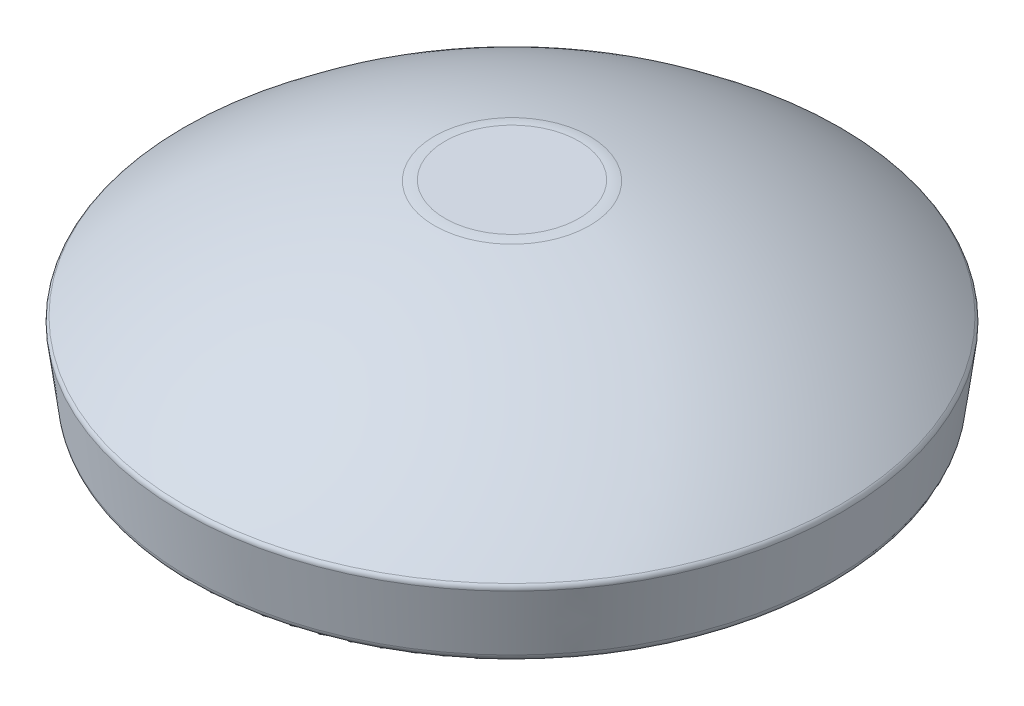
ISO-10303-21;
HEADER;
FILE_DESCRIPTION(('STEP AP214'),'2;1');
FILE_NAME('part.step','',(''),(''),'','','');
FILE_SCHEMA(('AUTOMOTIVE_DESIGN { 1 0 10303 214 1 1 1 1 }'));
ENDSEC;
DATA;
#1=APPLICATION_CONTEXT('core data for automotive mechanical design processes');
#2=APPLICATION_PROTOCOL_DEFINITION('international standard','automotive_design',2000,#1);
#3=PRODUCT_CONTEXT('',#1,'mechanical');
#4=PRODUCT('Part','Part','',(#3));
#5=PRODUCT_RELATED_PRODUCT_CATEGORY('part','',(#4));
#6=PRODUCT_DEFINITION_FORMATION('','',#4);
#7=PRODUCT_DEFINITION_CONTEXT('part definition',#1,'design');
#8=PRODUCT_DEFINITION('design','',#6,#7);
#9=PRODUCT_DEFINITION_SHAPE('','',#8);
#10=(LENGTH_UNIT() NAMED_UNIT(*) SI_UNIT(.MILLI.,.METRE.));
#11=(NAMED_UNIT(*) PLANE_ANGLE_UNIT() SI_UNIT($,.RADIAN.));
#12=(NAMED_UNIT(*) SI_UNIT($,.STERADIAN.) SOLID_ANGLE_UNIT());
#13=UNCERTAINTY_MEASURE_WITH_UNIT(LENGTH_MEASURE(1.E-05),#10,'distance_accuracy_value','');
#14=(GEOMETRIC_REPRESENTATION_CONTEXT(3) GLOBAL_UNCERTAINTY_ASSIGNED_CONTEXT((#13)) GLOBAL_UNIT_ASSIGNED_CONTEXT((#10,
#11,#12)) REPRESENTATION_CONTEXT('',''));
#15=CARTESIAN_POINT('',(0.,0.,0.));
#16=DIRECTION('',(0.,0.,1.));
#17=DIRECTION('',(1.,0.,0.));
#18=AXIS2_PLACEMENT_3D('',#15,#16,#17);
#19=CARTESIAN_POINT('',(0.,0.,0.));
#20=DIRECTION('',(0.,-1.,0.));
#21=DIRECTION('',(1.,0.,0.));
#22=AXIS2_PLACEMENT_3D('',#19,#20,#21);
#23=PLANE('',#22);
#24=CARTESIAN_POINT('',(0.,0.,0.));
#25=DIRECTION('',(0.,-1.,0.));
#26=DIRECTION('',(1.,0.,0.));
#27=AXIS2_PLACEMENT_3D('',#24,#25,#26);
#28=CIRCLE('',#27,13.7405967654397);
#29=CARTESIAN_POINT('',(13.7405967654397,0.,0.));
#30=VERTEX_POINT('',#29);
#31=EDGE_CURVE('E50',#30,#30,#28,.T.);
#32=ORIENTED_EDGE('',*,*,#31,.T.);
#33=EDGE_LOOP('',(#32));
#34=FACE_BOUND('',#33,.T.);
#35=DIRECTION('',(-1.,0.,0.));
#36=VECTOR('',#35,1.);
#37=CARTESIAN_POINT('',(-3.07418053105214,0.,-0.79375));
#38=LINE('',#37,#36);
#39=CARTESIAN_POINT('',(5.65961005171735,0.,-0.79375));
#40=VERTEX_POINT('',#39);
#41=CARTESIAN_POINT('',(-5.65961005171735,0.,-0.79375));
#42=VERTEX_POINT('',#41);
#43=EDGE_CURVE('E52',#40,#42,#38,.T.);
#44=ORIENTED_EDGE('',*,*,#43,.F.);
#45=CARTESIAN_POINT('',(0.,0.,0.));
#46=DIRECTION('',(0.,-1.,0.));
#47=DIRECTION('',(1.,0.,0.));
#48=AXIS2_PLACEMENT_3D('',#45,#46,#47);
#49=CIRCLE('',#48,5.715);
#50=EDGE_CURVE('E84',#40,#42,#49,.F.);
#51=ORIENTED_EDGE('',*,*,#50,.T.);
#52=EDGE_LOOP('',(#44,#51));
#53=FACE_BOUND('',#52,.T.);
#54=DIRECTION('',(1.,0.,0.));
#55=VECTOR('',#54,1.);
#56=CARTESIAN_POINT('',(-3.07418053105214,0.,0.79375));
#57=LINE('',#56,#55);
#58=CARTESIAN_POINT('',(-5.65961005171735,0.,0.79375));
#59=VERTEX_POINT('',#58);
#60=CARTESIAN_POINT('',(5.65961005171734,0.,0.79375));
#61=VERTEX_POINT('',#60);
#62=EDGE_CURVE('E94',#59,#61,#57,.T.);
#63=ORIENTED_EDGE('',*,*,#62,.F.);
#64=CARTESIAN_POINT('',(0.,0.,0.));
#65=DIRECTION('',(0.,-1.,0.));
#66=DIRECTION('',(1.,0.,0.));
#67=AXIS2_PLACEMENT_3D('',#64,#65,#66);
#68=CIRCLE('',#67,5.715);
#69=EDGE_CURVE('E107',#59,#61,#68,.F.);
#70=ORIENTED_EDGE('',*,*,#69,.T.);
#71=EDGE_LOOP('',(#63,#70));
#72=FACE_BOUND('',#71,.T.);
#73=ADVANCED_FACE('F39',(#34,#53,#72),#23,.T.);
#74=CARTESIAN_POINT('',(0.,0.,0.));
#75=DIRECTION('',(0.,1.,0.));
#76=DIRECTION('',(-1.,0.,0.));
#77=AXIS2_PLACEMENT_3D('',#74,#75,#76);
#78=CONICAL_SURFACE('',#77,14.097,0.130899693899568);
#79=CARTESIAN_POINT('',(0.,0.353354155481767,0.));
#80=DIRECTION('',(0.,-1.,0.));
#81=DIRECTION('',(1.,0.,0.));
#82=AXIS2_PLACEMENT_3D('',#79,#80,#81);
#83=CIRCLE('',#82,14.1435199571021);
#84=CARTESIAN_POINT('',(14.1435199571021,0.353354155481767,0.));
#85=VERTEX_POINT('',#84);
#86=EDGE_CURVE('E11',#85,#85,#83,.F.);
#87=ORIENTED_EDGE('',*,*,#86,.T.);
#88=EDGE_LOOP('',(#87));
#89=FACE_BOUND('',#88,.T.);
#90=CARTESIAN_POINT('',(0.,3.03636754474858,0.));
#91=DIRECTION('',(0.,-1.,0.));
#92=DIRECTION('',(1.,0.,0.));
#93=AXIS2_PLACEMENT_3D('',#90,#91,#92);
#94=CIRCLE('',#93,14.4967453708594);
#95=CARTESIAN_POINT('',(14.4967453708594,3.03636754474858,0.));
#96=VERTEX_POINT('',#95);
#97=EDGE_CURVE('E152',#96,#96,#94,.T.);
#98=ORIENTED_EDGE('',*,*,#97,.T.);
#99=EDGE_LOOP('',(#98));
#100=FACE_BOUND('',#99,.T.);
#101=ADVANCED_FACE('F171',(#89,#100),#78,.T.);
#102=CARTESIAN_POINT('',(0.,-15.3417582357825,0.));
#103=DIRECTION('',(0.,-1.,0.));
#104=DIRECTION('',(1.,0.,0.));
#105=AXIS2_PLACEMENT_3D('',#102,#103,#104);
#106=DEGENERATE_TOROIDAL_SURFACE('',#105,1.02240832640357,24.1719111757937,.F.);
#107=CARTESIAN_POINT('',(0.,3.2650426601994,0.));
#108=DIRECTION('',(0.,-1.,0.));
#109=DIRECTION('',(1.,0.,0.));
#110=AXIS2_PLACEMENT_3D('',#107,#108,#109);
#111=CIRCLE('',#110,14.4070521407595);
#112=CARTESIAN_POINT('',(14.4070521407595,3.2650426601994,0.));
#113=VERTEX_POINT('',#112);
#114=EDGE_CURVE('E186',#113,#113,#111,.F.);
#115=ORIENTED_EDGE('',*,*,#114,.T.);
#116=EDGE_LOOP('',(#115));
#117=FACE_BOUND('',#116,.T.);
#118=CARTESIAN_POINT('',(0.,8.4198079827753,0.));
#119=DIRECTION('',(0.,-1.,0.));
#120=DIRECTION('',(1.,0.,0.));
#121=AXIS2_PLACEMENT_3D('',#118,#119,#120);
#122=CIRCLE('',#121,3.41259570195462);
#123=CARTESIAN_POINT('',(3.41259570195462,8.4198079827753,0.));
#124=VERTEX_POINT('',#123);
#125=EDGE_CURVE('E90',#124,#124,#122,.T.);
#126=ORIENTED_EDGE('',*,*,#125,.T.);
#127=EDGE_LOOP('',(#126));
#128=FACE_BOUND('',#127,.T.);
#129=ADVANCED_FACE('F170',(#117,#128),#106,.F.);
#130=CARTESIAN_POINT('',(0.,8.46292729526157,0.));
#131=DIRECTION('',(0.,1.,0.));
#132=DIRECTION('',(-1.,0.,0.));
#133=AXIS2_PLACEMENT_3D('',#130,#131,#132);
#134=PLANE('',#133);
#135=CARTESIAN_POINT('',(0.,8.46292729526157,0.));
#136=DIRECTION('',(0.,1.,0.));
#137=DIRECTION('',(-1.,0.,0.));
#138=AXIS2_PLACEMENT_3D('',#135,#136,#137);
#139=CIRCLE('',#138,2.9465626212394);
#140=CARTESIAN_POINT('',(-2.9465626212394,8.46292729526157,0.));
#141=VERTEX_POINT('',#140);
#142=EDGE_CURVE('E106',#141,#141,#139,.T.);
#143=ORIENTED_EDGE('',*,*,#142,.T.);
#144=EDGE_LOOP('',(#143));
#145=FACE_BOUND('',#144,.T.);
#146=ADVANCED_FACE('F159',(#145),#134,.T.);
#147=CARTESIAN_POINT('',(-3.07418053105214,-2.54,0.79375));
#148=DIRECTION('',(0.,0.,1.));
#149=DIRECTION('',(1.,0.,0.));
#150=AXIS2_PLACEMENT_3D('',#147,#148,#149);
#151=PLANE('',#150);
#152=ORIENTED_EDGE('',*,*,#62,.T.);
#153=CARTESIAN_POINT('',(5.65961005171735,0.,0.79375));
#154=CARTESIAN_POINT('',(5.58636669045371,6.87876863831746E-06,0.79375));
#155=CARTESIAN_POINT('',(5.51312786882935,-0.00310690690221392,0.79375));
#156=CARTESIAN_POINT('',(5.36718058849575,-0.0155079510268095,0.79375));
#157=CARTESIAN_POINT('',(5.29447208602195,-0.0247946940943371,0.79375));
#158=CARTESIAN_POINT('',(5.15015725747529,-0.0494630612825748,0.79375));
#159=CARTESIAN_POINT('',(5.07855002583489,-0.0648393651336421,0.79375));
#160=CARTESIAN_POINT('',(4.93690093432029,-0.101552155733692,0.79375));
#161=CARTESIAN_POINT('',(4.8668590723264,-0.122888634411408,0.79375));
#162=CARTESIAN_POINT('',(4.65977700789013,-0.195644306264122,0.79375));
#163=CARTESIAN_POINT('',(4.52569660019021,-0.255824146479722,0.79375));
#164=CARTESIAN_POINT('',(4.26958149414839,-0.397740213595126,0.79375));
#165=CARTESIAN_POINT('',(4.14754593142529,-0.479474892094562,0.79375));
#166=CARTESIAN_POINT('',(3.91860310825917,-0.662509379665438,0.79375));
#167=CARTESIAN_POINT('',(3.81173527719307,-0.763858619662495,0.79375));
#168=CARTESIAN_POINT('',(3.61670606970322,-0.983245161335671,0.79375));
#169=CARTESIAN_POINT('',(3.52854827975405,-1.10128565529816,0.79375));
#170=CARTESIAN_POINT('',(3.37456729018714,-1.34952921628819,0.79375));
#171=CARTESIAN_POINT('',(3.30853384628879,-1.47960187151978,0.79375));
#172=CARTESIAN_POINT('',(3.19998378841046,-1.74915098864019,0.79375));
#173=CARTESIAN_POINT('',(3.15744252137307,-1.88861741938909,0.79375));
#174=CARTESIAN_POINT('',(3.10975549797157,-2.11435822783824,0.79375));
#175=CARTESIAN_POINT('',(3.09642822146772,-2.19898364373044,0.79375));
#176=CARTESIAN_POINT('',(3.07864064507304,-2.36905799309541,0.79375));
#177=CARTESIAN_POINT('',(3.07416973935671,-2.45450581827047,0.79375));
#178=CARTESIAN_POINT('',(3.07418053105216,-2.54000000000001,0.79375));
#179=B_SPLINE_CURVE_WITH_KNOTS('',3,(#153,#154,#155,#156,#157,#158,#159,#160,#161,#162,#163,
#164,#165,#166,#167,#168,#169,#170,#171,#172,#173,#174,#175,#176,#177,#178),.UNSPECIFIED.,.F.,
.F.,(4,2,2,2,2,2,2,2,2,2,2,2,4),(0.,0.219656159228749,0.4392939814543,0.658740334421184,
0.878186390215383,1.31682682722262,1.75543576289896,2.19516478509212,2.63497802171237,
3.07048467479963,3.50553342764897,3.76211696206469,4.01839304217818),.UNSPECIFIED.);
#180=CARTESIAN_POINT('',(3.07418053105214,-2.54,0.79375));
#181=VERTEX_POINT('',#180);
#182=EDGE_CURVE('E147',#61,#181,#179,.T.);
#183=ORIENTED_EDGE('',*,*,#182,.T.);
#184=DIRECTION('',(1.,0.,0.));
#185=VECTOR('',#184,1.);
#186=CARTESIAN_POINT('',(-3.07418053105214,-2.54,0.79375));
#187=LINE('',#186,#185);
#188=CARTESIAN_POINT('',(-3.07418053105214,-2.54,0.79375));
#189=VERTEX_POINT('',#188);
#190=EDGE_CURVE('E100',#189,#181,#187,.T.);
#191=ORIENTED_EDGE('',*,*,#190,.F.);
#192=CARTESIAN_POINT('',(-3.07418053105214,-2.54,0.79375));
#193=CARTESIAN_POINT('',(-3.07417105852471,-2.46986619805415,0.79375));
#194=CARTESIAN_POINT('',(-3.0771804273833,-2.39973703787502,0.79375));
#195=CARTESIAN_POINT('',(-3.08916382632629,-2.26000073647183,0.79375));
#196=CARTESIAN_POINT('',(-3.09813693151891,-2.19039351599477,0.79375));
#197=CARTESIAN_POINT('',(-3.12195238431243,-2.05232186236886,0.79375));
#198=CARTESIAN_POINT('',(-3.13678365038993,-1.98385552446674,0.79375));
#199=CARTESIAN_POINT('',(-3.1721623223253,-1.84843512030902,0.79375));
#200=CARTESIAN_POINT('',(-3.19270979173398,-1.78148107087548,0.79375));
#201=CARTESIAN_POINT('',(-3.26267532735932,-1.5835938026709,0.79375));
#202=CARTESIAN_POINT('',(-3.32043946349671,-1.4555040427704,0.79375));
#203=CARTESIAN_POINT('',(-3.45623467634301,-1.21064010045439,0.79375));
#204=CARTESIAN_POINT('',(-3.53427025083069,-1.09386843717667,0.79375));
#205=CARTESIAN_POINT('',(-3.7098867251761,-0.872499776888959,0.79375));
#206=CARTESIAN_POINT('',(-3.80780315097909,-0.768168615394767,0.79375));
#207=CARTESIAN_POINT('',(-4.01942066121958,-0.57695331140893,0.79375));
#208=CARTESIAN_POINT('',(-4.13312523875415,-0.490073040327871,0.79375));
#209=CARTESIAN_POINT('',(-4.37597494562483,-0.334238063248306,0.79375));
#210=CARTESIAN_POINT('',(-4.50541741550053,-0.265746684556386,0.79375));
#211=CARTESIAN_POINT('',(-4.77389405847477,-0.151351425506557,0.79375));
#212=CARTESIAN_POINT('',(-4.91292345129209,-0.105436379563344,0.79375));
#213=CARTESIAN_POINT('',(-5.15376636907871,-0.0477607587331356,0.79375));
#214=CARTESIAN_POINT('',(-5.25415650317867,-0.0298755756390392,0.79375));
#215=CARTESIAN_POINT('',(-5.45621965538979,-0.00599340021380845,0.79375));
#216=CARTESIAN_POINT('',(-5.55789101963787,1.75974360378702E-05,0.79375));
#217=CARTESIAN_POINT('',(-5.65961005171735,0.,0.79375));
#218=B_SPLINE_CURVE_WITH_KNOTS('',3,(#192,#193,#194,#195,#196,#197,#198,#199,#200,#201,#202,
#203,#204,#205,#206,#207,#208,#209,#210,#211,#212,#213,#214,#215,#216,#217),.UNSPECIFIED.,.F.,
.F.,(4,2,2,2,2,2,2,2,2,2,2,2,4),(0.,0.210328833714988,0.420625055989748,0.630525364432089,
0.840428006567772,1.25983809703533,1.67934132482251,2.10662161103482,2.5339965832383,
2.9713001177673,3.40838715683647,3.71363724744378,4.0185270873636),.UNSPECIFIED.);
#219=EDGE_CURVE('E136',#189,#59,#218,.T.);
#220=ORIENTED_EDGE('',*,*,#219,.T.);
#221=EDGE_LOOP('',(#152,#183,#191,#220));
#222=FACE_BOUND('',#221,.T.);
#223=ADVANCED_FACE('F153',(#222),#151,.F.);
#224=CARTESIAN_POINT('',(0.,-2.54,0.));
#225=DIRECTION('',(0.,-1.,0.));
#226=DIRECTION('',(0.,0.,-1.));
#227=AXIS2_PLACEMENT_3D('',#224,#225,#226);
#228=PLANE('',#227);
#229=CARTESIAN_POINT('',(0.,-2.54,0.));
#230=DIRECTION('',(0.,-1.,0.));
#231=DIRECTION('',(0.,0.,-1.));
#232=AXIS2_PLACEMENT_3D('',#229,#230,#231);
#233=CIRCLE('',#232,3.175);
#234=EDGE_CURVE('E96',#181,#189,#233,.T.);
#235=ORIENTED_EDGE('',*,*,#234,.T.);
#236=ORIENTED_EDGE('',*,*,#190,.T.);
#237=EDGE_LOOP('',(#235,#236));
#238=FACE_BOUND('',#237,.T.);
#239=ADVANCED_FACE('F158',(#238),#228,.T.);
#240=CARTESIAN_POINT('',(-3.07418053105214,-2.54,-0.79375));
#241=DIRECTION('',(0.,0.,-1.));
#242=DIRECTION('',(-1.,0.,0.));
#243=AXIS2_PLACEMENT_3D('',#240,#241,#242);
#244=PLANE('',#243);
#245=ORIENTED_EDGE('',*,*,#43,.T.);
#246=CARTESIAN_POINT('',(-5.65961005171735,0.,-0.79375));
#247=CARTESIAN_POINT('',(-5.58636669045371,6.87876863831746E-06,-0.79375));
#248=CARTESIAN_POINT('',(-5.51312786882935,-0.00310690690221392,-0.79375));
#249=CARTESIAN_POINT('',(-5.36718058849575,-0.0155079510268095,-0.79375));
#250=CARTESIAN_POINT('',(-5.29447208602195,-0.0247946940943371,-0.79375));
#251=CARTESIAN_POINT('',(-5.15015725747529,-0.0494630612825748,-0.79375));
#252=CARTESIAN_POINT('',(-5.07855002583489,-0.0648393651336421,-0.79375));
#253=CARTESIAN_POINT('',(-4.93690093432029,-0.101552155733692,-0.79375));
#254=CARTESIAN_POINT('',(-4.8668590723264,-0.122888634411408,-0.79375));
#255=CARTESIAN_POINT('',(-4.65977700789013,-0.195644306264122,-0.79375));
#256=CARTESIAN_POINT('',(-4.52569660019021,-0.255824146479722,-0.79375));
#257=CARTESIAN_POINT('',(-4.26958149414839,-0.397740213595126,-0.79375));
#258=CARTESIAN_POINT('',(-4.14754593142529,-0.479474892094562,-0.79375));
#259=CARTESIAN_POINT('',(-3.91860310825917,-0.662509379665438,-0.79375));
#260=CARTESIAN_POINT('',(-3.81173527719307,-0.763858619662495,-0.79375));
#261=CARTESIAN_POINT('',(-3.61670606970322,-0.983245161335671,-0.79375));
#262=CARTESIAN_POINT('',(-3.52854827975405,-1.10128565529816,-0.79375));
#263=CARTESIAN_POINT('',(-3.37456729018714,-1.34952921628819,-0.79375));
#264=CARTESIAN_POINT('',(-3.30853384628879,-1.47960187151978,-0.79375));
#265=CARTESIAN_POINT('',(-3.19998378841046,-1.74915098864019,-0.79375));
#266=CARTESIAN_POINT('',(-3.15744252137307,-1.88861741938909,-0.79375));
#267=CARTESIAN_POINT('',(-3.10975549797157,-2.11435822783824,-0.79375));
#268=CARTESIAN_POINT('',(-3.09642822146772,-2.19898364373044,-0.79375));
#269=CARTESIAN_POINT('',(-3.07864064507304,-2.36905799309541,-0.79375));
#270=CARTESIAN_POINT('',(-3.07416973935671,-2.45450581827047,-0.79375));
#271=CARTESIAN_POINT('',(-3.07418053105216,-2.54000000000001,-0.79375));
#272=B_SPLINE_CURVE_WITH_KNOTS('',3,(#246,#247,#248,#249,#250,#251,#252,#253,#254,#255,#256,
#257,#258,#259,#260,#261,#262,#263,#264,#265,#266,#267,#268,#269,#270,#271),.UNSPECIFIED.,.F.,
.F.,(4,2,2,2,2,2,2,2,2,2,2,2,4),(0.,0.219656159228749,0.4392939814543,0.658740334421184,
0.878186390215383,1.31682682722262,1.75543576289896,2.19516478509212,2.63497802171237,
3.07048467479963,3.50553342764897,3.76211696206469,4.01839304217818),.UNSPECIFIED.);
#273=CARTESIAN_POINT('',(-3.07418053105214,-2.54,-0.79375));
#274=VERTEX_POINT('',#273);
#275=EDGE_CURVE('E81',#42,#274,#272,.T.);
#276=ORIENTED_EDGE('',*,*,#275,.T.);
#277=DIRECTION('',(-1.,0.,0.));
#278=VECTOR('',#277,1.);
#279=CARTESIAN_POINT('',(-3.07418053105214,-2.54,-0.79375));
#280=LINE('',#279,#278);
#281=CARTESIAN_POINT('',(3.07418053105214,-2.54,-0.79375));
#282=VERTEX_POINT('',#281);
#283=EDGE_CURVE('E87',#282,#274,#280,.T.);
#284=ORIENTED_EDGE('',*,*,#283,.F.);
#285=CARTESIAN_POINT('',(3.07418053105214,-2.54,-0.79375));
#286=CARTESIAN_POINT('',(3.07417105852471,-2.46986619805415,-0.79375));
#287=CARTESIAN_POINT('',(3.0771804273833,-2.39973703787502,-0.79375));
#288=CARTESIAN_POINT('',(3.08916382632629,-2.26000073647183,-0.79375));
#289=CARTESIAN_POINT('',(3.09813693151891,-2.19039351599477,-0.79375));
#290=CARTESIAN_POINT('',(3.12195238431243,-2.05232186236886,-0.79375));
#291=CARTESIAN_POINT('',(3.13678365038993,-1.98385552446674,-0.79375));
#292=CARTESIAN_POINT('',(3.1721623223253,-1.84843512030902,-0.79375));
#293=CARTESIAN_POINT('',(3.19270979173398,-1.78148107087548,-0.79375));
#294=CARTESIAN_POINT('',(3.26267532735932,-1.5835938026709,-0.79375));
#295=CARTESIAN_POINT('',(3.32043946349671,-1.4555040427704,-0.79375));
#296=CARTESIAN_POINT('',(3.45623467634301,-1.21064010045439,-0.79375));
#297=CARTESIAN_POINT('',(3.53427025083069,-1.09386843717667,-0.79375));
#298=CARTESIAN_POINT('',(3.7098867251761,-0.872499776888959,-0.79375));
#299=CARTESIAN_POINT('',(3.80780315097909,-0.768168615394767,-0.79375));
#300=CARTESIAN_POINT('',(4.01942066121958,-0.57695331140893,-0.79375));
#301=CARTESIAN_POINT('',(4.13312523875415,-0.490073040327871,-0.79375));
#302=CARTESIAN_POINT('',(4.37597494562483,-0.334238063248306,-0.79375));
#303=CARTESIAN_POINT('',(4.50541741550053,-0.265746684556386,-0.79375));
#304=CARTESIAN_POINT('',(4.77389405847477,-0.151351425506557,-0.79375));
#305=CARTESIAN_POINT('',(4.91292345129209,-0.105436379563344,-0.79375));
#306=CARTESIAN_POINT('',(5.15376636907871,-0.0477607587331356,-0.79375));
#307=CARTESIAN_POINT('',(5.25415650317867,-0.0298755756390392,-0.79375));
#308=CARTESIAN_POINT('',(5.45621965538979,-0.00599340021380845,-0.79375));
#309=CARTESIAN_POINT('',(5.55789101963787,1.75974360378702E-05,-0.79375));
#310=CARTESIAN_POINT('',(5.65961005171735,0.,-0.79375));
#311=B_SPLINE_CURVE_WITH_KNOTS('',3,(#285,#286,#287,#288,#289,#290,#291,#292,#293,#294,#295,
#296,#297,#298,#299,#300,#301,#302,#303,#304,#305,#306,#307,#308,#309,#310),.UNSPECIFIED.,.F.,
.F.,(4,2,2,2,2,2,2,2,2,2,2,2,4),(0.,0.210328833714988,0.420625055989748,0.630525364432089,
0.840428006567772,1.25983809703533,1.67934132482251,2.10662161103482,2.5339965832383,
2.9713001177673,3.40838715683647,3.71363724744378,4.0185270873636),.UNSPECIFIED.);
#312=EDGE_CURVE('E80',#282,#40,#311,.T.);
#313=ORIENTED_EDGE('',*,*,#312,.T.);
#314=EDGE_LOOP('',(#245,#276,#284,#313));
#315=FACE_BOUND('',#314,.T.);
#316=ADVANCED_FACE('F89',(#315),#244,.F.);
#317=CARTESIAN_POINT('',(0.,-2.54,0.));
#318=DIRECTION('',(0.,-1.,0.));
#319=DIRECTION('',(0.,0.,-1.));
#320=AXIS2_PLACEMENT_3D('',#317,#318,#319);
#321=PLANE('',#320);
#322=CARTESIAN_POINT('',(0.,-2.54,0.));
#323=DIRECTION('',(0.,-1.,0.));
#324=DIRECTION('',(0.,0.,-1.));
#325=AXIS2_PLACEMENT_3D('',#322,#323,#324);
#326=CIRCLE('',#325,3.175);
#327=EDGE_CURVE('E85',#274,#282,#326,.T.);
#328=ORIENTED_EDGE('',*,*,#327,.T.);
#329=ORIENTED_EDGE('',*,*,#283,.T.);
#330=EDGE_LOOP('',(#328,#329));
#331=FACE_BOUND('',#330,.T.);
#332=ADVANCED_FACE('F95',(#331),#321,.T.);
#333=CARTESIAN_POINT('',(0.,5.92292729526157,0.));
#334=DIRECTION('',(0.,1.,0.));
#335=DIRECTION('',(-1.,0.,0.));
#336=AXIS2_PLACEMENT_3D('',#333,#334,#335);
#337=TOROIDAL_SURFACE('',#336,2.9465626212394,2.54);
#338=ORIENTED_EDGE('',*,*,#142,.F.);
#339=EDGE_LOOP('',(#338));
#340=FACE_BOUND('',#339,.T.);
#341=ORIENTED_EDGE('',*,*,#125,.F.);
#342=EDGE_LOOP('',(#341));
#343=FACE_BOUND('',#342,.T.);
#344=ADVANCED_FACE('F132',(#340,#343),#337,.T.);
#345=CARTESIAN_POINT('',(0.,-2.54,0.));
#346=DIRECTION('',(0.,-1.,0.));
#347=DIRECTION('',(1.,0.,0.));
#348=AXIS2_PLACEMENT_3D('',#345,#346,#347);
#349=TOROIDAL_SURFACE('',#348,5.715,2.54);
#350=ORIENTED_EDGE('',*,*,#275,.F.);
#351=ORIENTED_EDGE('',*,*,#50,.F.);
#352=ORIENTED_EDGE('',*,*,#312,.F.);
#353=ORIENTED_EDGE('',*,*,#327,.F.);
#354=EDGE_LOOP('',(#350,#351,#352,#353));
#355=FACE_BOUND('',#354,.T.);
#356=ADVANCED_FACE('F78',(#355),#349,.F.);
#357=CARTESIAN_POINT('',(0.,-2.54,0.));
#358=DIRECTION('',(0.,-1.,0.));
#359=DIRECTION('',(1.,0.,0.));
#360=AXIS2_PLACEMENT_3D('',#357,#358,#359);
#361=TOROIDAL_SURFACE('',#360,5.715,2.54);
#362=ORIENTED_EDGE('',*,*,#182,.F.);
#363=ORIENTED_EDGE('',*,*,#69,.F.);
#364=ORIENTED_EDGE('',*,*,#219,.F.);
#365=ORIENTED_EDGE('',*,*,#234,.F.);
#366=EDGE_LOOP('',(#362,#363,#364,#365));
#367=FACE_BOUND('',#366,.T.);
#368=ADVANCED_FACE('F131',(#367),#361,.F.);
#369=CARTESIAN_POINT('',(0.,3.06952119757247,0.));
#370=DIRECTION('',(0.,1.,0.));
#371=DIRECTION('',(-1.,0.,0.));
#372=AXIS2_PLACEMENT_3D('',#369,#370,#371);
#373=TOROIDAL_SURFACE('',#372,14.2449183760705,0.254);
#374=ORIENTED_EDGE('',*,*,#114,.F.);
#375=EDGE_LOOP('',(#374));
#376=FACE_BOUND('',#375,.T.);
#377=ORIENTED_EDGE('',*,*,#97,.F.);
#378=EDGE_LOOP('',(#377));
#379=FACE_BOUND('',#378,.T.);
#380=ADVANCED_FACE('F140',(#376,#379),#373,.T.);
#381=CARTESIAN_POINT('',(0.,0.4064,0.));
#382=DIRECTION('',(0.,-1.,0.));
#383=DIRECTION('',(1.,0.,0.));
#384=AXIS2_PLACEMENT_3D('',#381,#382,#383);
#385=TOROIDAL_SURFACE('',#384,13.7405967654397,0.4064);
#386=ORIENTED_EDGE('',*,*,#86,.F.);
#387=EDGE_LOOP('',(#386));
#388=FACE_BOUND('',#387,.T.);
#389=ORIENTED_EDGE('',*,*,#31,.F.);
#390=EDGE_LOOP('',(#389));
#391=FACE_BOUND('',#390,.T.);
#392=ADVANCED_FACE('F41',(#388,#391),#385,.T.);
#393=CLOSED_SHELL('',(#73,#101,#129,#146,#223,#239,#316,#332,#344,#356,#368,#380,#392));
#394=MANIFOLD_SOLID_BREP('B2',#393);
#395=ADVANCED_BREP_SHAPE_REPRESENTATION('',(#18,#394),#14);
#396=SHAPE_DEFINITION_REPRESENTATION(#9,#395);
ENDSEC;
END-ISO-10303-21;
